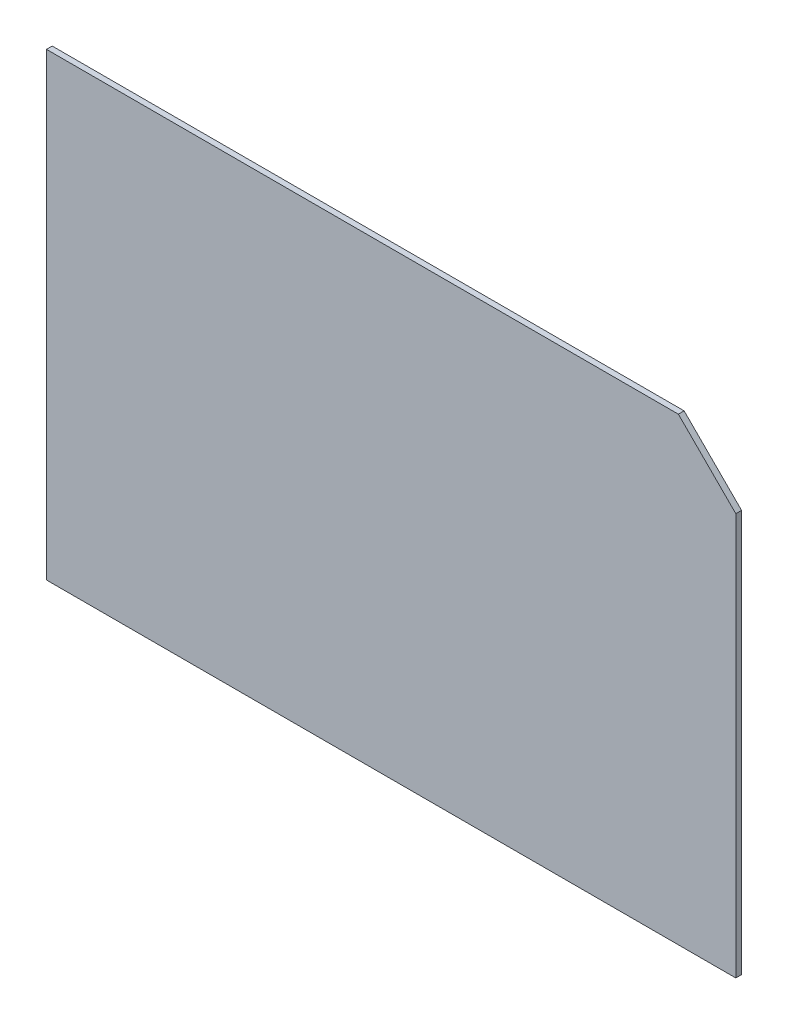
ISO-10303-21;
HEADER;
FILE_DESCRIPTION(('STEP AP214'),'2;1');
FILE_NAME('part.step','',(''),(''),'','','');
FILE_SCHEMA(('AUTOMOTIVE_DESIGN { 1 0 10303 214 1 1 1 1 }'));
ENDSEC;
DATA;
#1=APPLICATION_CONTEXT('core data for automotive mechanical design processes');
#2=APPLICATION_PROTOCOL_DEFINITION('international standard','automotive_design',2000,#1);
#3=PRODUCT_CONTEXT('',#1,'mechanical');
#4=PRODUCT('Part','Part','',(#3));
#5=PRODUCT_RELATED_PRODUCT_CATEGORY('part','',(#4));
#6=PRODUCT_DEFINITION_FORMATION('','',#4);
#7=PRODUCT_DEFINITION_CONTEXT('part definition',#1,'design');
#8=PRODUCT_DEFINITION('design','',#6,#7);
#9=PRODUCT_DEFINITION_SHAPE('','',#8);
#10=(LENGTH_UNIT() NAMED_UNIT(*) SI_UNIT(.MILLI.,.METRE.));
#11=(NAMED_UNIT(*) PLANE_ANGLE_UNIT() SI_UNIT($,.RADIAN.));
#12=(NAMED_UNIT(*) SI_UNIT($,.STERADIAN.) SOLID_ANGLE_UNIT());
#13=UNCERTAINTY_MEASURE_WITH_UNIT(LENGTH_MEASURE(1.E-05),#10,'distance_accuracy_value','');
#14=(GEOMETRIC_REPRESENTATION_CONTEXT(3) GLOBAL_UNCERTAINTY_ASSIGNED_CONTEXT((#13)) GLOBAL_UNIT_ASSIGNED_CONTEXT((#10,
#11,#12)) REPRESENTATION_CONTEXT('',''));
#15=CARTESIAN_POINT('',(0.,0.,0.));
#16=DIRECTION('',(0.,0.,1.));
#17=DIRECTION('',(1.,0.,0.));
#18=AXIS2_PLACEMENT_3D('',#15,#16,#17);
#19=CARTESIAN_POINT('',(-1500.,1000.,-25.));
#20=DIRECTION('',(-1.,0.,0.));
#21=DIRECTION('',(0.,-1.,0.));
#22=AXIS2_PLACEMENT_3D('',#19,#20,#21);
#23=PLANE('',#22);
#24=DIRECTION('',(0.,-1.,0.));
#25=VECTOR('',#24,1.);
#26=CARTESIAN_POINT('',(-1500.,1000.,0.));
#27=LINE('',#26,#25);
#28=CARTESIAN_POINT('',(-1500.,1000.,0.));
#29=VERTEX_POINT('',#28);
#30=CARTESIAN_POINT('',(-1500.,-1000.,0.));
#31=VERTEX_POINT('',#30);
#32=EDGE_CURVE('E119',#29,#31,#27,.T.);
#33=ORIENTED_EDGE('',*,*,#32,.F.);
#34=DIRECTION('',(0.,0.,1.));
#35=VECTOR('',#34,1.);
#36=CARTESIAN_POINT('',(-1500.,1000.,-25.));
#37=LINE('',#36,#35);
#38=CARTESIAN_POINT('',(-1500.,1000.,-25.));
#39=VERTEX_POINT('',#38);
#40=EDGE_CURVE('E11',#39,#29,#37,.T.);
#41=ORIENTED_EDGE('',*,*,#40,.F.);
#42=DIRECTION('',(0.,-1.,0.));
#43=VECTOR('',#42,1.);
#44=CARTESIAN_POINT('',(-1500.,1000.,-25.));
#45=LINE('',#44,#43);
#46=CARTESIAN_POINT('',(-1500.,-1000.,-25.));
#47=VERTEX_POINT('',#46);
#48=EDGE_CURVE('E117',#39,#47,#45,.T.);
#49=ORIENTED_EDGE('',*,*,#48,.T.);
#50=DIRECTION('',(0.,0.,1.));
#51=VECTOR('',#50,1.);
#52=CARTESIAN_POINT('',(-1500.,-1000.,-25.));
#53=LINE('',#52,#51);
#54=EDGE_CURVE('E42',#47,#31,#53,.T.);
#55=ORIENTED_EDGE('',*,*,#54,.T.);
#56=EDGE_LOOP('',(#33,#41,#49,#55));
#57=FACE_BOUND('',#56,.T.);
#58=ADVANCED_FACE('F39',(#57),#23,.T.);
#59=CARTESIAN_POINT('',(-1500.,1000.,-25.));
#60=DIRECTION('',(0.,1.,0.));
#61=DIRECTION('',(0.,0.,1.));
#62=AXIS2_PLACEMENT_3D('',#59,#60,#61);
#63=PLANE('',#62);
#64=DIRECTION('',(0.,0.,1.));
#65=VECTOR('',#64,1.);
#66=CARTESIAN_POINT('',(1250.,1000.,-932.));
#67=LINE('',#66,#65);
#68=CARTESIAN_POINT('',(1250.,1000.,-25.));
#69=VERTEX_POINT('',#68);
#70=CARTESIAN_POINT('',(1250.,1000.,0.));
#71=VERTEX_POINT('',#70);
#72=EDGE_CURVE('E56',#69,#71,#67,.T.);
#73=ORIENTED_EDGE('',*,*,#72,.F.);
#74=DIRECTION('',(-1.,0.,0.));
#75=VECTOR('',#74,1.);
#76=CARTESIAN_POINT('',(-1500.,1000.,-25.));
#77=LINE('',#76,#75);
#78=EDGE_CURVE('E63',#69,#39,#77,.T.);
#79=ORIENTED_EDGE('',*,*,#78,.T.);
#80=ORIENTED_EDGE('',*,*,#40,.T.);
#81=DIRECTION('',(-1.,0.,0.));
#82=VECTOR('',#81,1.);
#83=CARTESIAN_POINT('',(-1500.,1000.,0.));
#84=LINE('',#83,#82);
#85=EDGE_CURVE('E81',#71,#29,#84,.T.);
#86=ORIENTED_EDGE('',*,*,#85,.F.);
#87=EDGE_LOOP('',(#73,#79,#80,#86));
#88=FACE_BOUND('',#87,.T.);
#89=ADVANCED_FACE('F146',(#88),#63,.T.);
#90=CARTESIAN_POINT('',(1500.,1000.,-25.));
#91=DIRECTION('',(1.,0.,0.));
#92=DIRECTION('',(0.,1.,0.));
#93=AXIS2_PLACEMENT_3D('',#90,#91,#92);
#94=PLANE('',#93);
#95=DIRECTION('',(0.,0.,1.));
#96=VECTOR('',#95,1.);
#97=CARTESIAN_POINT('',(1500.,750.,-932.));
#98=LINE('',#97,#96);
#99=CARTESIAN_POINT('',(1500.,750.,-25.));
#100=VERTEX_POINT('',#99);
#101=CARTESIAN_POINT('',(1500.,750.,0.));
#102=VERTEX_POINT('',#101);
#103=EDGE_CURVE('E96',#100,#102,#98,.T.);
#104=ORIENTED_EDGE('',*,*,#103,.T.);
#105=DIRECTION('',(0.,1.,0.));
#106=VECTOR('',#105,1.);
#107=CARTESIAN_POINT('',(1500.,1000.,0.));
#108=LINE('',#107,#106);
#109=CARTESIAN_POINT('',(1500.,-1000.,0.));
#110=VERTEX_POINT('',#109);
#111=EDGE_CURVE('E105',#110,#102,#108,.T.);
#112=ORIENTED_EDGE('',*,*,#111,.F.);
#113=DIRECTION('',(0.,0.,1.));
#114=VECTOR('',#113,1.);
#115=CARTESIAN_POINT('',(1500.,-1000.,-25.));
#116=LINE('',#115,#114);
#117=CARTESIAN_POINT('',(1500.,-1000.,-25.));
#118=VERTEX_POINT('',#117);
#119=EDGE_CURVE('E48',#118,#110,#116,.T.);
#120=ORIENTED_EDGE('',*,*,#119,.F.);
#121=DIRECTION('',(0.,1.,0.));
#122=VECTOR('',#121,1.);
#123=CARTESIAN_POINT('',(1500.,1000.,-25.));
#124=LINE('',#123,#122);
#125=EDGE_CURVE('E108',#118,#100,#124,.T.);
#126=ORIENTED_EDGE('',*,*,#125,.T.);
#127=EDGE_LOOP('',(#104,#112,#120,#126));
#128=FACE_BOUND('',#127,.T.);
#129=ADVANCED_FACE('F104',(#128),#94,.T.);
#130=CARTESIAN_POINT('',(-1500.,-1000.,-25.));
#131=DIRECTION('',(0.,-1.,0.));
#132=DIRECTION('',(0.,0.,-1.));
#133=AXIS2_PLACEMENT_3D('',#130,#131,#132);
#134=PLANE('',#133);
#135=DIRECTION('',(1.,0.,0.));
#136=VECTOR('',#135,1.);
#137=CARTESIAN_POINT('',(-1500.,-1000.,0.));
#138=LINE('',#137,#136);
#139=EDGE_CURVE('E112',#31,#110,#138,.T.);
#140=ORIENTED_EDGE('',*,*,#139,.F.);
#141=ORIENTED_EDGE('',*,*,#54,.F.);
#142=DIRECTION('',(1.,0.,0.));
#143=VECTOR('',#142,1.);
#144=CARTESIAN_POINT('',(-1500.,-1000.,-25.));
#145=LINE('',#144,#143);
#146=EDGE_CURVE('E130',#47,#118,#145,.T.);
#147=ORIENTED_EDGE('',*,*,#146,.T.);
#148=ORIENTED_EDGE('',*,*,#119,.T.);
#149=EDGE_LOOP('',(#140,#141,#147,#148));
#150=FACE_BOUND('',#149,.T.);
#151=ADVANCED_FACE('F143',(#150),#134,.T.);
#152=CARTESIAN_POINT('',(0.,0.,-25.));
#153=DIRECTION('',(0.,0.,1.));
#154=DIRECTION('',(1.,0.,0.));
#155=AXIS2_PLACEMENT_3D('',#152,#153,#154);
#156=PLANE('',#155);
#157=ORIENTED_EDGE('',*,*,#78,.F.);
#158=DIRECTION('',(0.707106781186544,-0.707106781186551,0.));
#159=VECTOR('',#158,1.);
#160=CARTESIAN_POINT('',(1125.00000000001,1125.,-25.));
#161=LINE('',#160,#159);
#162=EDGE_CURVE('E134',#69,#100,#161,.T.);
#163=ORIENTED_EDGE('',*,*,#162,.T.);
#164=ORIENTED_EDGE('',*,*,#125,.F.);
#165=ORIENTED_EDGE('',*,*,#146,.F.);
#166=ORIENTED_EDGE('',*,*,#48,.F.);
#167=EDGE_LOOP('',(#157,#163,#164,#165,#166));
#168=FACE_BOUND('',#167,.T.);
#169=ADVANCED_FACE('F145',(#168),#156,.F.);
#170=CARTESIAN_POINT('',(0.,0.,0.));
#171=DIRECTION('',(0.,0.,1.));
#172=DIRECTION('',(1.,0.,0.));
#173=AXIS2_PLACEMENT_3D('',#170,#171,#172);
#174=PLANE('',#173);
#175=DIRECTION('',(0.707106781186544,-0.707106781186551,0.));
#176=VECTOR('',#175,1.);
#177=CARTESIAN_POINT('',(1250.,1000.,0.));
#178=LINE('',#177,#176);
#179=EDGE_CURVE('E93',#71,#102,#178,.T.);
#180=ORIENTED_EDGE('',*,*,#179,.F.);
#181=ORIENTED_EDGE('',*,*,#85,.T.);
#182=ORIENTED_EDGE('',*,*,#32,.T.);
#183=ORIENTED_EDGE('',*,*,#139,.T.);
#184=ORIENTED_EDGE('',*,*,#111,.T.);
#185=EDGE_LOOP('',(#180,#181,#182,#183,#184));
#186=FACE_BOUND('',#185,.T.);
#187=ADVANCED_FACE('F111',(#186),#174,.T.);
#188=CARTESIAN_POINT('',(1250.,1000.,-932.));
#189=DIRECTION('',(-0.707106781186551,-0.707106781186544,0.));
#190=DIRECTION('',(0.707106781186544,-0.707106781186551,0.));
#191=AXIS2_PLACEMENT_3D('',#188,#189,#190);
#192=PLANE('',#191);
#193=ORIENTED_EDGE('',*,*,#72,.T.);
#194=ORIENTED_EDGE('',*,*,#179,.T.);
#195=ORIENTED_EDGE('',*,*,#103,.F.);
#196=ORIENTED_EDGE('',*,*,#162,.F.);
#197=EDGE_LOOP('',(#193,#194,#195,#196));
#198=FACE_BOUND('',#197,.T.);
#199=ADVANCED_FACE('F95',(#198),#192,.F.);
#200=CLOSED_SHELL('',(#58,#89,#129,#151,#169,#187,#199));
#201=MANIFOLD_SOLID_BREP('B2',#200);
#202=ADVANCED_BREP_SHAPE_REPRESENTATION('',(#18,#201),#14);
#203=SHAPE_DEFINITION_REPRESENTATION(#9,#202);
ENDSEC;
END-ISO-10303-21;
